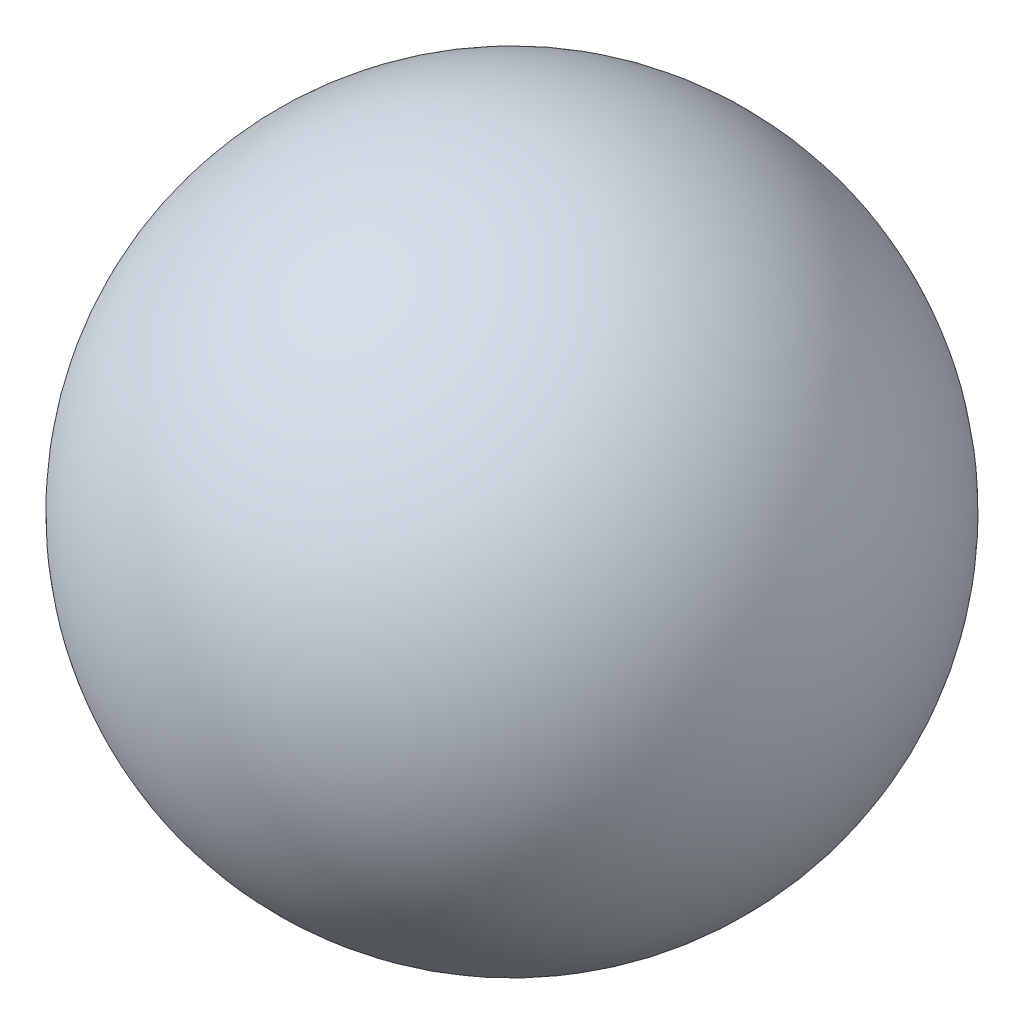
ISO-10303-21;
HEADER;
FILE_DESCRIPTION(('STEP AP214'),'2;1');
FILE_NAME('part.step','',(''),(''),'','','');
FILE_SCHEMA(('AUTOMOTIVE_DESIGN { 1 0 10303 214 1 1 1 1 }'));
ENDSEC;
DATA;
#1=APPLICATION_CONTEXT('core data for automotive mechanical design processes');
#2=APPLICATION_PROTOCOL_DEFINITION('international standard','automotive_design',2000,#1);
#3=PRODUCT_CONTEXT('',#1,'mechanical');
#4=PRODUCT('Part','Part','',(#3));
#5=PRODUCT_RELATED_PRODUCT_CATEGORY('part','',(#4));
#6=PRODUCT_DEFINITION_FORMATION('','',#4);
#7=PRODUCT_DEFINITION_CONTEXT('part definition',#1,'design');
#8=PRODUCT_DEFINITION('design','',#6,#7);
#9=PRODUCT_DEFINITION_SHAPE('','',#8);
#10=(LENGTH_UNIT() NAMED_UNIT(*) SI_UNIT(.MILLI.,.METRE.));
#11=(NAMED_UNIT(*) PLANE_ANGLE_UNIT() SI_UNIT($,.RADIAN.));
#12=(NAMED_UNIT(*) SI_UNIT($,.STERADIAN.) SOLID_ANGLE_UNIT());
#13=UNCERTAINTY_MEASURE_WITH_UNIT(LENGTH_MEASURE(1.E-05),#10,'distance_accuracy_value','');
#14=(GEOMETRIC_REPRESENTATION_CONTEXT(3) GLOBAL_UNCERTAINTY_ASSIGNED_CONTEXT((#13)) GLOBAL_UNIT_ASSIGNED_CONTEXT((#10,
#11,#12)) REPRESENTATION_CONTEXT('',''));
#15=CARTESIAN_POINT('',(0.,0.,0.));
#16=DIRECTION('',(0.,0.,1.));
#17=DIRECTION('',(1.,0.,0.));
#18=AXIS2_PLACEMENT_3D('',#15,#16,#17);
#19=CARTESIAN_POINT('',(0.,0.,0.));
#20=DIRECTION('',(0.,0.,-1.));
#21=DIRECTION('',(1.,0.,0.));
#22=AXIS2_PLACEMENT_3D('',#19,#20,#21);
#23=SPHERICAL_SURFACE('',#22,8.);
#24=CARTESIAN_POINT('',(0.,0.,-8.));
#25=VERTEX_POINT('',#24);
#26=VERTEX_LOOP('',#25);
#27=FACE_BOUND('',#26,.T.);
#28=ADVANCED_FACE('F33',(#27),#23,.T.);
#29=CLOSED_SHELL('',(#28));
#30=MANIFOLD_SOLID_BREP('B2',#29);
#31=ADVANCED_BREP_SHAPE_REPRESENTATION('',(#18,#30),#14);
#32=SHAPE_DEFINITION_REPRESENTATION(#9,#31);
ENDSEC;
END-ISO-10303-21;
